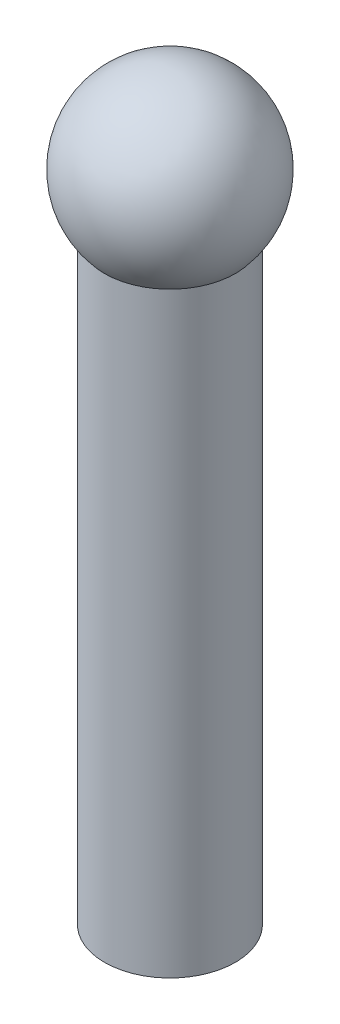
ISO-10303-21;
HEADER;
FILE_DESCRIPTION(('STEP AP214'),'2;1');
FILE_NAME('part.step','',(''),(''),'','','');
FILE_SCHEMA(('AUTOMOTIVE_DESIGN { 1 0 10303 214 1 1 1 1 }'));
ENDSEC;
DATA;
#1=APPLICATION_CONTEXT('core data for automotive mechanical design processes');
#2=APPLICATION_PROTOCOL_DEFINITION('international standard','automotive_design',2000,#1);
#3=PRODUCT_CONTEXT('',#1,'mechanical');
#4=PRODUCT('Part','Part','',(#3));
#5=PRODUCT_RELATED_PRODUCT_CATEGORY('part','',(#4));
#6=PRODUCT_DEFINITION_FORMATION('','',#4);
#7=PRODUCT_DEFINITION_CONTEXT('part definition',#1,'design');
#8=PRODUCT_DEFINITION('design','',#6,#7);
#9=PRODUCT_DEFINITION_SHAPE('','',#8);
#10=(LENGTH_UNIT() NAMED_UNIT(*) SI_UNIT(.MILLI.,.METRE.));
#11=(NAMED_UNIT(*) PLANE_ANGLE_UNIT() SI_UNIT($,.RADIAN.));
#12=(NAMED_UNIT(*) SI_UNIT($,.STERADIAN.) SOLID_ANGLE_UNIT());
#13=UNCERTAINTY_MEASURE_WITH_UNIT(LENGTH_MEASURE(1.E-05),#10,'distance_accuracy_value','');
#14=(GEOMETRIC_REPRESENTATION_CONTEXT(3) GLOBAL_UNCERTAINTY_ASSIGNED_CONTEXT((#13)) GLOBAL_UNIT_ASSIGNED_CONTEXT((#10,
#11,#12)) REPRESENTATION_CONTEXT('',''));
#15=CARTESIAN_POINT('',(0.,0.,0.));
#16=DIRECTION('',(0.,0.,1.));
#17=DIRECTION('',(1.,0.,0.));
#18=AXIS2_PLACEMENT_3D('',#15,#16,#17);
#19=CARTESIAN_POINT('',(0.,75.,0.));
#20=DIRECTION('',(0.,-1.,0.));
#21=DIRECTION('',(0.,0.,-1.));
#22=AXIS2_PLACEMENT_3D('',#19,#20,#21);
#23=CYLINDRICAL_SURFACE('',#22,7.5);
#24=CARTESIAN_POINT('',(0.,0.,0.));
#25=DIRECTION('',(0.,1.,0.));
#26=DIRECTION('',(0.,0.,1.));
#27=AXIS2_PLACEMENT_3D('',#24,#25,#26);
#28=CIRCLE('',#27,7.5);
#29=CARTESIAN_POINT('',(0.,0.,7.5));
#30=VERTEX_POINT('',#29);
#31=EDGE_CURVE('E37',#30,#30,#28,.T.);
#32=ORIENTED_EDGE('',*,*,#31,.T.);
#33=EDGE_LOOP('',(#32));
#34=FACE_BOUND('',#33,.T.);
#35=CARTESIAN_POINT('',(0.,68.3856217223385,0.));
#36=DIRECTION('',(0.,1.,0.));
#37=DIRECTION('',(0.,0.,1.));
#38=AXIS2_PLACEMENT_3D('',#35,#36,#37);
#39=CIRCLE('',#38,7.5);
#40=CARTESIAN_POINT('',(0.,68.3856217223385,7.5));
#41=VERTEX_POINT('',#40);
#42=EDGE_CURVE('E10',#41,#41,#39,.T.);
#43=ORIENTED_EDGE('',*,*,#42,.F.);
#44=EDGE_LOOP('',(#43));
#45=FACE_BOUND('',#44,.T.);
#46=ADVANCED_FACE('F31',(#34,#45),#23,.T.);
#47=CARTESIAN_POINT('',(0.,0.,0.));
#48=DIRECTION('',(0.,1.,0.));
#49=DIRECTION('',(0.,0.,1.));
#50=AXIS2_PLACEMENT_3D('',#47,#48,#49);
#51=PLANE('',#50);
#52=ORIENTED_EDGE('',*,*,#31,.F.);
#53=EDGE_LOOP('',(#52));
#54=FACE_BOUND('',#53,.T.);
#55=ADVANCED_FACE('F45',(#54),#51,.F.);
#56=CARTESIAN_POINT('',(0.,75.,0.));
#57=DIRECTION('',(0.,0.,-1.));
#58=DIRECTION('',(1.,0.,0.));
#59=AXIS2_PLACEMENT_3D('',#56,#57,#58);
#60=SPHERICAL_SURFACE('',#59,10.);
#61=CARTESIAN_POINT('',(0.,75.,0.));
#62=DIRECTION('',(0.,1.,0.));
#63=DIRECTION('',(0.,0.,1.));
#64=AXIS2_PLACEMENT_3D('',#61,#62,#63);
#65=SPHERICAL_SURFACE('',#64,10.);
#66=ORIENTED_EDGE('',*,*,#42,.T.);
#67=EDGE_LOOP('',(#66));
#68=FACE_BOUND('',#67,.T.);
#69=ADVANCED_FACE('F47',(#68),#65,.T.);
#70=CLOSED_SHELL('',(#46,#55,#69));
#71=MANIFOLD_SOLID_BREP('B2',#70);
#72=ADVANCED_BREP_SHAPE_REPRESENTATION('',(#18,#71),#14);
#73=SHAPE_DEFINITION_REPRESENTATION(#9,#72);
ENDSEC;
END-ISO-10303-21;
